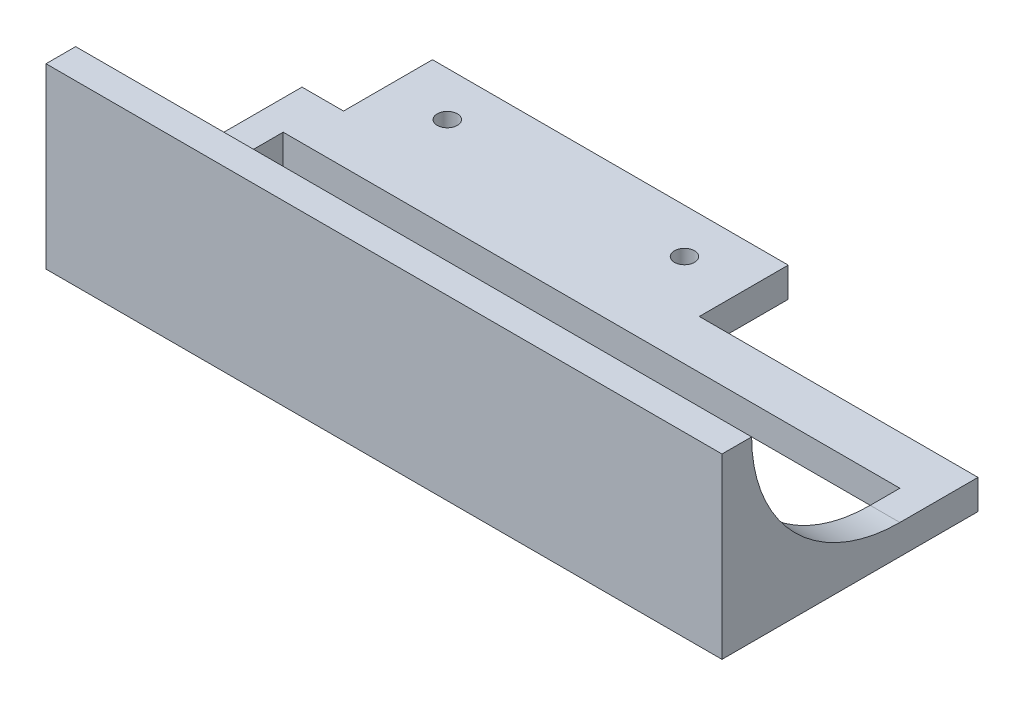
ISO-10303-21;
HEADER;
FILE_DESCRIPTION(('STEP AP214'),'2;1');
FILE_NAME('part.step','',(''),(''),'','','');
FILE_SCHEMA(('AUTOMOTIVE_DESIGN { 1 0 10303 214 1 1 1 1 }'));
ENDSEC;
DATA;
#1=APPLICATION_CONTEXT('core data for automotive mechanical design processes');
#2=APPLICATION_PROTOCOL_DEFINITION('international standard','automotive_design',2000,#1);
#3=PRODUCT_CONTEXT('',#1,'mechanical');
#4=PRODUCT('Part','Part','',(#3));
#5=PRODUCT_RELATED_PRODUCT_CATEGORY('part','',(#4));
#6=PRODUCT_DEFINITION_FORMATION('','',#4);
#7=PRODUCT_DEFINITION_CONTEXT('part definition',#1,'design');
#8=PRODUCT_DEFINITION('design','',#6,#7);
#9=PRODUCT_DEFINITION_SHAPE('','',#8);
#10=(LENGTH_UNIT() NAMED_UNIT(*) SI_UNIT(.MILLI.,.METRE.));
#11=(NAMED_UNIT(*) PLANE_ANGLE_UNIT() SI_UNIT($,.RADIAN.));
#12=(NAMED_UNIT(*) SI_UNIT($,.STERADIAN.) SOLID_ANGLE_UNIT());
#13=UNCERTAINTY_MEASURE_WITH_UNIT(LENGTH_MEASURE(1.E-05),#10,'distance_accuracy_value','');
#14=(GEOMETRIC_REPRESENTATION_CONTEXT(3) GLOBAL_UNCERTAINTY_ASSIGNED_CONTEXT((#13)) GLOBAL_UNIT_ASSIGNED_CONTEXT((#10,
#11,#12)) REPRESENTATION_CONTEXT('',''));
#15=CARTESIAN_POINT('',(0.,0.,0.));
#16=DIRECTION('',(0.,0.,1.));
#17=DIRECTION('',(1.,0.,0.));
#18=AXIS2_PLACEMENT_3D('',#15,#16,#17);
#19=CARTESIAN_POINT('',(7.,5.,0.));
#20=DIRECTION('',(1.,0.,0.));
#21=DIRECTION('',(0.,0.,-1.));
#22=AXIS2_PLACEMENT_3D('',#19,#20,#21);
#23=PLANE('',#22);
#24=DIRECTION('',(0.,0.,1.));
#25=VECTOR('',#24,1.);
#26=CARTESIAN_POINT('',(7.,0.,0.));
#27=LINE('',#26,#25);
#28=CARTESIAN_POINT('',(7.,0.,8.52801006597785));
#29=VERTEX_POINT('',#28);
#30=CARTESIAN_POINT('',(7.,0.,23.5280100659778));
#31=VERTEX_POINT('',#30);
#32=EDGE_CURVE('E225',#29,#31,#27,.T.);
#33=ORIENTED_EDGE('',*,*,#32,.T.);
#34=DIRECTION('',(0.,-1.,0.));
#35=VECTOR('',#34,1.);
#36=CARTESIAN_POINT('',(7.,5.,23.5280100659778));
#37=LINE('',#36,#35);
#38=CARTESIAN_POINT('',(7.,5.,23.5280100659778));
#39=VERTEX_POINT('',#38);
#40=EDGE_CURVE('E262',#39,#31,#37,.T.);
#41=ORIENTED_EDGE('',*,*,#40,.F.);
#42=DIRECTION('',(0.,0.,1.));
#43=VECTOR('',#42,1.);
#44=CARTESIAN_POINT('',(7.,5.,0.));
#45=LINE('',#44,#43);
#46=CARTESIAN_POINT('',(7.,5.,8.52801006597785));
#47=VERTEX_POINT('',#46);
#48=EDGE_CURVE('E187',#47,#39,#45,.T.);
#49=ORIENTED_EDGE('',*,*,#48,.F.);
#50=DIRECTION('',(0.,-1.,0.));
#51=VECTOR('',#50,1.);
#52=CARTESIAN_POINT('',(7.,5.,8.52801006597785));
#53=LINE('',#52,#51);
#54=EDGE_CURVE('E248',#47,#29,#53,.T.);
#55=ORIENTED_EDGE('',*,*,#54,.T.);
#56=EDGE_LOOP('',(#33,#41,#49,#55));
#57=FACE_BOUND('',#56,.T.);
#58=ADVANCED_FACE('F35',(#57),#23,.F.);
#59=CARTESIAN_POINT('',(0.,5.,23.5280100659778));
#60=DIRECTION('',(0.,0.,1.));
#61=DIRECTION('',(1.,0.,0.));
#62=AXIS2_PLACEMENT_3D('',#59,#60,#61);
#63=PLANE('',#62);
#64=DIRECTION('',(-1.,0.,0.));
#65=VECTOR('',#64,1.);
#66=CARTESIAN_POINT('',(0.,0.,23.5280100659778));
#67=LINE('',#66,#65);
#68=CARTESIAN_POINT('',(0.,0.,23.5280100659778));
#69=VERTEX_POINT('',#68);
#70=EDGE_CURVE('E228',#31,#69,#67,.T.);
#71=ORIENTED_EDGE('',*,*,#70,.T.);
#72=DIRECTION('',(0.,-1.,0.));
#73=VECTOR('',#72,1.);
#74=CARTESIAN_POINT('',(0.,5.,23.5280100659778));
#75=LINE('',#74,#73);
#76=CARTESIAN_POINT('',(0.,5.,23.5280100659778));
#77=VERTEX_POINT('',#76);
#78=EDGE_CURVE('E260',#77,#69,#75,.T.);
#79=ORIENTED_EDGE('',*,*,#78,.F.);
#80=DIRECTION('',(-1.,0.,0.));
#81=VECTOR('',#80,1.);
#82=CARTESIAN_POINT('',(0.,5.,23.5280100659778));
#83=LINE('',#82,#81);
#84=EDGE_CURVE('E190',#39,#77,#83,.T.);
#85=ORIENTED_EDGE('',*,*,#84,.F.);
#86=ORIENTED_EDGE('',*,*,#40,.T.);
#87=EDGE_LOOP('',(#71,#79,#85,#86));
#88=FACE_BOUND('',#87,.T.);
#89=ADVANCED_FACE('F319',(#88),#63,.F.);
#90=CARTESIAN_POINT('',(0.,5.,0.));
#91=DIRECTION('',(-1.,0.,0.));
#92=DIRECTION('',(0.,0.,1.));
#93=AXIS2_PLACEMENT_3D('',#90,#91,#92);
#94=PLANE('',#93);
#95=DIRECTION('',(0.,0.,-1.));
#96=VECTOR('',#95,1.);
#97=CARTESIAN_POINT('',(0.,0.,0.));
#98=LINE('',#97,#96);
#99=CARTESIAN_POINT('',(0.,0.,66.7030100659778));
#100=VERTEX_POINT('',#99);
#101=EDGE_CURVE('E231',#100,#69,#98,.T.);
#102=ORIENTED_EDGE('',*,*,#101,.F.);
#103=DIRECTION('',(0.,-1.,0.));
#104=VECTOR('',#103,1.);
#105=CARTESIAN_POINT('',(0.,5.,66.7030100659778));
#106=LINE('',#105,#104);
#107=CARTESIAN_POINT('',(0.,30.,66.7030100659778));
#108=VERTEX_POINT('',#107);
#109=EDGE_CURVE('E164',#108,#100,#106,.T.);
#110=ORIENTED_EDGE('',*,*,#109,.F.);
#111=DIRECTION('',(0.,0.,1.));
#112=VECTOR('',#111,1.);
#113=CARTESIAN_POINT('',(0.,30.,61.7030100659778));
#114=LINE('',#113,#112);
#115=CARTESIAN_POINT('',(0.,30.,61.7030100659778));
#116=VERTEX_POINT('',#115);
#117=EDGE_CURVE('E156',#116,#108,#114,.T.);
#118=ORIENTED_EDGE('',*,*,#117,.F.);
#119=CARTESIAN_POINT('',(0.,30.,36.7030100659778));
#120=DIRECTION('',(-1.,0.,0.));
#121=DIRECTION('',(0.,0.,1.));
#122=AXIS2_PLACEMENT_3D('',#119,#120,#121);
#123=CIRCLE('',#122,25.);
#124=CARTESIAN_POINT('',(0.,5.,36.7030100659778));
#125=VERTEX_POINT('',#124);
#126=EDGE_CURVE('E141',#116,#125,#123,.F.);
#127=ORIENTED_EDGE('',*,*,#126,.T.);
#128=DIRECTION('',(0.,0.,-1.));
#129=VECTOR('',#128,1.);
#130=CARTESIAN_POINT('',(0.,5.,0.));
#131=LINE('',#130,#129);
#132=EDGE_CURVE('E193',#125,#77,#131,.T.);
#133=ORIENTED_EDGE('',*,*,#132,.T.);
#134=ORIENTED_EDGE('',*,*,#78,.T.);
#135=EDGE_LOOP('',(#102,#110,#118,#127,#133,#134));
#136=FACE_BOUND('',#135,.T.);
#137=ADVANCED_FACE('F163',(#136),#94,.T.);
#138=CARTESIAN_POINT('',(0.,5.,66.7030100659778));
#139=DIRECTION('',(0.,0.,1.));
#140=DIRECTION('',(1.,0.,0.));
#141=AXIS2_PLACEMENT_3D('',#138,#139,#140);
#142=PLANE('',#141);
#143=DIRECTION('',(-1.,0.,0.));
#144=VECTOR('',#143,1.);
#145=CARTESIAN_POINT('',(0.,0.,66.7030100659778));
#146=LINE('',#145,#144);
#147=CARTESIAN_POINT('',(114.,0.,66.7030100659778));
#148=VERTEX_POINT('',#147);
#149=EDGE_CURVE('E234',#148,#100,#146,.T.);
#150=ORIENTED_EDGE('',*,*,#149,.F.);
#151=DIRECTION('',(0.,-1.,0.));
#152=VECTOR('',#151,1.);
#153=CARTESIAN_POINT('',(114.,5.,66.7030100659778));
#154=LINE('',#153,#152);
#155=CARTESIAN_POINT('',(114.,30.,66.7030100659778));
#156=VERTEX_POINT('',#155);
#157=EDGE_CURVE('E257',#156,#148,#154,.T.);
#158=ORIENTED_EDGE('',*,*,#157,.F.);
#159=DIRECTION('',(1.,0.,0.));
#160=VECTOR('',#159,1.);
#161=CARTESIAN_POINT('',(0.,30.,66.7030100659778));
#162=LINE('',#161,#160);
#163=EDGE_CURVE('E165',#108,#156,#162,.T.);
#164=ORIENTED_EDGE('',*,*,#163,.F.);
#165=ORIENTED_EDGE('',*,*,#109,.T.);
#166=EDGE_LOOP('',(#150,#158,#164,#165));
#167=FACE_BOUND('',#166,.T.);
#168=ADVANCED_FACE('F298',(#167),#142,.T.);
#169=CARTESIAN_POINT('',(114.,5.,0.));
#170=DIRECTION('',(1.,0.,0.));
#171=DIRECTION('',(0.,0.,-1.));
#172=AXIS2_PLACEMENT_3D('',#169,#170,#171);
#173=PLANE('',#172);
#174=DIRECTION('',(0.,0.,1.));
#175=VECTOR('',#174,1.);
#176=CARTESIAN_POINT('',(114.,0.,0.));
#177=LINE('',#176,#175);
#178=CARTESIAN_POINT('',(114.,0.,23.5280100659778));
#179=VERTEX_POINT('',#178);
#180=EDGE_CURVE('E237',#179,#148,#177,.T.);
#181=ORIENTED_EDGE('',*,*,#180,.F.);
#182=DIRECTION('',(0.,-1.,0.));
#183=VECTOR('',#182,1.);
#184=CARTESIAN_POINT('',(114.,5.,23.5280100659778));
#185=LINE('',#184,#183);
#186=CARTESIAN_POINT('',(114.,5.,23.5280100659778));
#187=VERTEX_POINT('',#186);
#188=EDGE_CURVE('E255',#187,#179,#185,.T.);
#189=ORIENTED_EDGE('',*,*,#188,.F.);
#190=DIRECTION('',(0.,0.,1.));
#191=VECTOR('',#190,1.);
#192=CARTESIAN_POINT('',(114.,5.,0.));
#193=LINE('',#192,#191);
#194=CARTESIAN_POINT('',(114.,5.,36.7030100659778));
#195=VERTEX_POINT('',#194);
#196=EDGE_CURVE('E195',#187,#195,#193,.T.);
#197=ORIENTED_EDGE('',*,*,#196,.T.);
#198=CARTESIAN_POINT('',(114.,30.,36.7030100659778));
#199=DIRECTION('',(1.,0.,0.));
#200=DIRECTION('',(0.,0.,-1.));
#201=AXIS2_PLACEMENT_3D('',#198,#199,#200);
#202=CIRCLE('',#201,25.);
#203=CARTESIAN_POINT('',(114.,30.,61.7030100659778));
#204=VERTEX_POINT('',#203);
#205=EDGE_CURVE('E11',#195,#204,#202,.F.);
#206=ORIENTED_EDGE('',*,*,#205,.T.);
#207=DIRECTION('',(0.,0.,-1.));
#208=VECTOR('',#207,1.);
#209=CARTESIAN_POINT('',(114.,30.,66.7030100659778));
#210=LINE('',#209,#208);
#211=EDGE_CURVE('E167',#156,#204,#210,.T.);
#212=ORIENTED_EDGE('',*,*,#211,.F.);
#213=ORIENTED_EDGE('',*,*,#157,.T.);
#214=EDGE_LOOP('',(#181,#189,#197,#206,#212,#213));
#215=FACE_BOUND('',#214,.T.);
#216=ADVANCED_FACE('F295',(#215),#173,.T.);
#217=CARTESIAN_POINT('',(0.,5.,23.5280100659778));
#218=DIRECTION('',(0.,0.,-1.));
#219=DIRECTION('',(-1.,0.,0.));
#220=AXIS2_PLACEMENT_3D('',#217,#218,#219);
#221=PLANE('',#220);
#222=DIRECTION('',(1.,0.,0.));
#223=VECTOR('',#222,1.);
#224=CARTESIAN_POINT('',(0.,0.,23.5280100659778));
#225=LINE('',#224,#223);
#226=CARTESIAN_POINT('',(67.,0.,23.5280100659778));
#227=VERTEX_POINT('',#226);
#228=EDGE_CURVE('E240',#227,#179,#225,.T.);
#229=ORIENTED_EDGE('',*,*,#228,.F.);
#230=DIRECTION('',(0.,-1.,0.));
#231=VECTOR('',#230,1.);
#232=CARTESIAN_POINT('',(67.,5.,23.5280100659778));
#233=LINE('',#232,#231);
#234=CARTESIAN_POINT('',(67.,5.,23.5280100659778));
#235=VERTEX_POINT('',#234);
#236=EDGE_CURVE('E253',#235,#227,#233,.T.);
#237=ORIENTED_EDGE('',*,*,#236,.F.);
#238=DIRECTION('',(1.,0.,0.));
#239=VECTOR('',#238,1.);
#240=CARTESIAN_POINT('',(0.,5.,23.5280100659778));
#241=LINE('',#240,#239);
#242=EDGE_CURVE('E198',#235,#187,#241,.T.);
#243=ORIENTED_EDGE('',*,*,#242,.T.);
#244=ORIENTED_EDGE('',*,*,#188,.T.);
#245=EDGE_LOOP('',(#229,#237,#243,#244));
#246=FACE_BOUND('',#245,.T.);
#247=ADVANCED_FACE('F305',(#246),#221,.T.);
#248=CARTESIAN_POINT('',(67.,5.,0.));
#249=DIRECTION('',(1.,0.,0.));
#250=DIRECTION('',(0.,0.,-1.));
#251=AXIS2_PLACEMENT_3D('',#248,#249,#250);
#252=PLANE('',#251);
#253=DIRECTION('',(0.,0.,1.));
#254=VECTOR('',#253,1.);
#255=CARTESIAN_POINT('',(67.,0.,0.));
#256=LINE('',#255,#254);
#257=CARTESIAN_POINT('',(67.,0.,8.52801006597785));
#258=VERTEX_POINT('',#257);
#259=EDGE_CURVE('E243',#258,#227,#256,.T.);
#260=ORIENTED_EDGE('',*,*,#259,.F.);
#261=DIRECTION('',(0.,-1.,0.));
#262=VECTOR('',#261,1.);
#263=CARTESIAN_POINT('',(67.,5.,8.52801006597785));
#264=LINE('',#263,#262);
#265=CARTESIAN_POINT('',(67.,5.,8.52801006597785));
#266=VERTEX_POINT('',#265);
#267=EDGE_CURVE('E250',#266,#258,#264,.T.);
#268=ORIENTED_EDGE('',*,*,#267,.F.);
#269=DIRECTION('',(0.,0.,1.));
#270=VECTOR('',#269,1.);
#271=CARTESIAN_POINT('',(67.,5.,0.));
#272=LINE('',#271,#270);
#273=EDGE_CURVE('E201',#266,#235,#272,.T.);
#274=ORIENTED_EDGE('',*,*,#273,.T.);
#275=ORIENTED_EDGE('',*,*,#236,.T.);
#276=EDGE_LOOP('',(#260,#268,#274,#275));
#277=FACE_BOUND('',#276,.T.);
#278=ADVANCED_FACE('F310',(#277),#252,.T.);
#279=CARTESIAN_POINT('',(5.,5.,0.));
#280=DIRECTION('',(1.,0.,0.));
#281=DIRECTION('',(0.,0.,-1.));
#282=AXIS2_PLACEMENT_3D('',#279,#280,#281);
#283=PLANE('',#282);
#284=DIRECTION('',(0.,0.,1.));
#285=VECTOR('',#284,1.);
#286=CARTESIAN_POINT('',(5.,0.,0.));
#287=LINE('',#286,#285);
#288=CARTESIAN_POINT('',(5.00000000000001,0.,31.7030100659779));
#289=VERTEX_POINT('',#288);
#290=CARTESIAN_POINT('',(5.00000000000001,0.,61.7030100659778));
#291=VERTEX_POINT('',#290);
#292=EDGE_CURVE('E213',#289,#291,#287,.T.);
#293=ORIENTED_EDGE('',*,*,#292,.F.);
#294=DIRECTION('',(0.,-1.,0.));
#295=VECTOR('',#294,1.);
#296=CARTESIAN_POINT('',(5.00000000000001,5.,31.7030100659779));
#297=LINE('',#296,#295);
#298=CARTESIAN_POINT('',(5.00000000000001,5.,31.7030100659779));
#299=VERTEX_POINT('',#298);
#300=EDGE_CURVE('E251',#299,#289,#297,.T.);
#301=ORIENTED_EDGE('',*,*,#300,.F.);
#302=DIRECTION('',(0.,0.,1.));
#303=VECTOR('',#302,1.);
#304=CARTESIAN_POINT('',(5.,5.,0.));
#305=LINE('',#304,#303);
#306=CARTESIAN_POINT('',(5.00000000000001,5.,36.7030100659778));
#307=VERTEX_POINT('',#306);
#308=EDGE_CURVE('E180',#299,#307,#305,.T.);
#309=ORIENTED_EDGE('',*,*,#308,.T.);
#310=CARTESIAN_POINT('',(5.00000000000001,30.,36.7030100659778));
#311=DIRECTION('',(1.,0.,0.));
#312=DIRECTION('',(0.,0.,-1.));
#313=AXIS2_PLACEMENT_3D('',#310,#311,#312);
#314=CIRCLE('',#313,25.);
#315=CARTESIAN_POINT('',(5.,30.,61.7030100659778));
#316=VERTEX_POINT('',#315);
#317=EDGE_CURVE('E148',#307,#316,#314,.F.);
#318=ORIENTED_EDGE('',*,*,#317,.T.);
#319=DIRECTION('',(0.,-1.,0.));
#320=VECTOR('',#319,1.);
#321=CARTESIAN_POINT('',(5.00000000000001,5.,61.7030100659778));
#322=LINE('',#321,#320);
#323=EDGE_CURVE('E207',#316,#291,#322,.T.);
#324=ORIENTED_EDGE('',*,*,#323,.T.);
#325=EDGE_LOOP('',(#293,#301,#309,#318,#324));
#326=FACE_BOUND('',#325,.T.);
#327=ADVANCED_FACE('F277',(#326),#283,.T.);
#328=CARTESIAN_POINT('',(0.,5.,31.7030100659779));
#329=DIRECTION('',(0.,0.,1.));
#330=DIRECTION('',(1.,0.,0.));
#331=AXIS2_PLACEMENT_3D('',#328,#329,#330);
#332=PLANE('',#331);
#333=DIRECTION('',(-1.,0.,0.));
#334=VECTOR('',#333,1.);
#335=CARTESIAN_POINT('',(0.,0.,31.7030100659779));
#336=LINE('',#335,#334);
#337=CARTESIAN_POINT('',(109.,0.,31.7030100659778));
#338=VERTEX_POINT('',#337);
#339=EDGE_CURVE('E216',#338,#289,#336,.T.);
#340=ORIENTED_EDGE('',*,*,#339,.F.);
#341=DIRECTION('',(0.,-1.,0.));
#342=VECTOR('',#341,1.);
#343=CARTESIAN_POINT('',(109.,5.,31.7030100659778));
#344=LINE('',#343,#342);
#345=CARTESIAN_POINT('',(109.,5.,31.7030100659778));
#346=VERTEX_POINT('',#345);
#347=EDGE_CURVE('E269',#346,#338,#344,.T.);
#348=ORIENTED_EDGE('',*,*,#347,.F.);
#349=DIRECTION('',(-1.,0.,0.));
#350=VECTOR('',#349,1.);
#351=CARTESIAN_POINT('',(0.,5.,31.7030100659779));
#352=LINE('',#351,#350);
#353=EDGE_CURVE('E182',#346,#299,#352,.T.);
#354=ORIENTED_EDGE('',*,*,#353,.T.);
#355=ORIENTED_EDGE('',*,*,#300,.T.);
#356=EDGE_LOOP('',(#340,#348,#354,#355));
#357=FACE_BOUND('',#356,.T.);
#358=ADVANCED_FACE('F284',(#357),#332,.T.);
#359=CARTESIAN_POINT('',(109.,5.,0.));
#360=DIRECTION('',(-1.,0.,0.));
#361=DIRECTION('',(0.,0.,1.));
#362=AXIS2_PLACEMENT_3D('',#359,#360,#361);
#363=PLANE('',#362);
#364=DIRECTION('',(0.,0.,-1.));
#365=VECTOR('',#364,1.);
#366=CARTESIAN_POINT('',(109.,0.,0.));
#367=LINE('',#366,#365);
#368=CARTESIAN_POINT('',(109.,0.,61.7030100659778));
#369=VERTEX_POINT('',#368);
#370=EDGE_CURVE('E219',#369,#338,#367,.T.);
#371=ORIENTED_EDGE('',*,*,#370,.F.);
#372=DIRECTION('',(0.,-1.,0.));
#373=VECTOR('',#372,1.);
#374=CARTESIAN_POINT('',(109.,5.,61.7030100659778));
#375=LINE('',#374,#373);
#376=CARTESIAN_POINT('',(109.,30.,61.7030100659778));
#377=VERTEX_POINT('',#376);
#378=EDGE_CURVE('E267',#377,#369,#375,.T.);
#379=ORIENTED_EDGE('',*,*,#378,.F.);
#380=CARTESIAN_POINT('',(109.,30.,36.7030100659778));
#381=DIRECTION('',(-1.,0.,0.));
#382=DIRECTION('',(0.,0.,1.));
#383=AXIS2_PLACEMENT_3D('',#380,#381,#382);
#384=CIRCLE('',#383,25.);
#385=CARTESIAN_POINT('',(109.,5.,36.7030100659778));
#386=VERTEX_POINT('',#385);
#387=EDGE_CURVE('E43',#377,#386,#384,.F.);
#388=ORIENTED_EDGE('',*,*,#387,.T.);
#389=DIRECTION('',(0.,0.,-1.));
#390=VECTOR('',#389,1.);
#391=CARTESIAN_POINT('',(109.,5.,0.));
#392=LINE('',#391,#390);
#393=EDGE_CURVE('E185',#386,#346,#392,.T.);
#394=ORIENTED_EDGE('',*,*,#393,.T.);
#395=ORIENTED_EDGE('',*,*,#347,.T.);
#396=EDGE_LOOP('',(#371,#379,#388,#394,#395));
#397=FACE_BOUND('',#396,.T.);
#398=ADVANCED_FACE('F286',(#397),#363,.T.);
#399=CARTESIAN_POINT('',(0.,5.,61.7030100659778));
#400=DIRECTION('',(0.,0.,-1.));
#401=DIRECTION('',(-1.,0.,0.));
#402=AXIS2_PLACEMENT_3D('',#399,#400,#401);
#403=PLANE('',#402);
#404=ORIENTED_EDGE('',*,*,#323,.F.);
#405=DIRECTION('',(-1.,0.,0.));
#406=VECTOR('',#405,1.);
#407=CARTESIAN_POINT('',(114.,30.,61.7030100659778));
#408=LINE('',#407,#406);
#409=EDGE_CURVE('E159',#377,#316,#408,.T.);
#410=ORIENTED_EDGE('',*,*,#409,.F.);
#411=ORIENTED_EDGE('',*,*,#378,.T.);
#412=DIRECTION('',(1.,0.,0.));
#413=VECTOR('',#412,1.);
#414=CARTESIAN_POINT('',(0.,0.,61.7030100659778));
#415=LINE('',#414,#413);
#416=EDGE_CURVE('E222',#291,#369,#415,.T.);
#417=ORIENTED_EDGE('',*,*,#416,.F.);
#418=EDGE_LOOP('',(#404,#410,#411,#417));
#419=FACE_BOUND('',#418,.T.);
#420=ADVANCED_FACE('F330',(#419),#403,.T.);
#421=CARTESIAN_POINT('',(17.,5.,16.0280100659779));
#422=DIRECTION('',(0.,-1.,0.));
#423=DIRECTION('',(0.,0.,-1.));
#424=AXIS2_PLACEMENT_3D('',#421,#422,#423);
#425=CYLINDRICAL_SURFACE('',#424,1.7);
#426=CARTESIAN_POINT('',(17.,5.,16.0280100659779));
#427=DIRECTION('',(0.,1.,0.));
#428=DIRECTION('',(0.,0.,1.));
#429=AXIS2_PLACEMENT_3D('',#426,#427,#428);
#430=CIRCLE('',#429,1.7);
#431=CARTESIAN_POINT('',(17.,5.,17.7280100659779));
#432=VERTEX_POINT('',#431);
#433=EDGE_CURVE('E176',#432,#432,#430,.T.);
#434=ORIENTED_EDGE('',*,*,#433,.T.);
#435=EDGE_LOOP('',(#434));
#436=FACE_BOUND('',#435,.T.);
#437=CARTESIAN_POINT('',(17.,0.,16.0280100659779));
#438=DIRECTION('',(0.,1.,0.));
#439=DIRECTION('',(0.,0.,1.));
#440=AXIS2_PLACEMENT_3D('',#437,#438,#439);
#441=CIRCLE('',#440,1.7);
#442=CARTESIAN_POINT('',(17.,0.,17.7280100659779));
#443=VERTEX_POINT('',#442);
#444=EDGE_CURVE('E210',#443,#443,#441,.T.);
#445=ORIENTED_EDGE('',*,*,#444,.F.);
#446=EDGE_LOOP('',(#445));
#447=FACE_BOUND('',#446,.T.);
#448=ADVANCED_FACE('F333',(#436,#447),#425,.F.);
#449=CARTESIAN_POINT('',(57.,5.,16.0280100659778));
#450=DIRECTION('',(0.,-1.,0.));
#451=DIRECTION('',(0.,0.,-1.));
#452=AXIS2_PLACEMENT_3D('',#449,#450,#451);
#453=CYLINDRICAL_SURFACE('',#452,1.7);
#454=CARTESIAN_POINT('',(57.,5.,16.0280100659778));
#455=DIRECTION('',(0.,1.,0.));
#456=DIRECTION('',(0.,0.,1.));
#457=AXIS2_PLACEMENT_3D('',#454,#455,#456);
#458=CIRCLE('',#457,1.7);
#459=CARTESIAN_POINT('',(57.,5.,17.7280100659778));
#460=VERTEX_POINT('',#459);
#461=EDGE_CURVE('E173',#460,#460,#458,.T.);
#462=ORIENTED_EDGE('',*,*,#461,.T.);
#463=EDGE_LOOP('',(#462));
#464=FACE_BOUND('',#463,.T.);
#465=CARTESIAN_POINT('',(57.,0.,16.0280100659778));
#466=DIRECTION('',(0.,1.,0.));
#467=DIRECTION('',(0.,0.,1.));
#468=AXIS2_PLACEMENT_3D('',#465,#466,#467);
#469=CIRCLE('',#468,1.7);
#470=CARTESIAN_POINT('',(57.,0.,17.7280100659778));
#471=VERTEX_POINT('',#470);
#472=EDGE_CURVE('E172',#471,#471,#469,.T.);
#473=ORIENTED_EDGE('',*,*,#472,.F.);
#474=EDGE_LOOP('',(#473));
#475=FACE_BOUND('',#474,.T.);
#476=ADVANCED_FACE('F343',(#464,#475),#453,.F.);
#477=CARTESIAN_POINT('',(0.,5.,8.52801006597785));
#478=DIRECTION('',(0.,0.,-1.));
#479=DIRECTION('',(-1.,0.,0.));
#480=AXIS2_PLACEMENT_3D('',#477,#478,#479);
#481=PLANE('',#480);
#482=DIRECTION('',(1.,0.,0.));
#483=VECTOR('',#482,1.);
#484=CARTESIAN_POINT('',(0.,0.,8.52801006597785));
#485=LINE('',#484,#483);
#486=EDGE_CURVE('E177',#29,#258,#485,.T.);
#487=ORIENTED_EDGE('',*,*,#486,.F.);
#488=ORIENTED_EDGE('',*,*,#54,.F.);
#489=DIRECTION('',(1.,0.,0.));
#490=VECTOR('',#489,1.);
#491=CARTESIAN_POINT('',(0.,5.,8.52801006597785));
#492=LINE('',#491,#490);
#493=EDGE_CURVE('E204',#47,#266,#492,.T.);
#494=ORIENTED_EDGE('',*,*,#493,.T.);
#495=ORIENTED_EDGE('',*,*,#267,.T.);
#496=EDGE_LOOP('',(#487,#488,#494,#495));
#497=FACE_BOUND('',#496,.T.);
#498=ADVANCED_FACE('F313',(#497),#481,.T.);
#499=CARTESIAN_POINT('',(0.,5.,0.));
#500=DIRECTION('',(0.,1.,0.));
#501=DIRECTION('',(0.,0.,1.));
#502=AXIS2_PLACEMENT_3D('',#499,#500,#501);
#503=PLANE('',#502);
#504=ORIENTED_EDGE('',*,*,#132,.F.);
#505=DIRECTION('',(-1.,0.,0.));
#506=VECTOR('',#505,1.);
#507=CARTESIAN_POINT('',(5.00000000000001,5.,36.7030100659778));
#508=LINE('',#507,#506);
#509=EDGE_CURVE('E57',#125,#307,#508,.F.);
#510=ORIENTED_EDGE('',*,*,#509,.T.);
#511=ORIENTED_EDGE('',*,*,#308,.F.);
#512=ORIENTED_EDGE('',*,*,#353,.F.);
#513=ORIENTED_EDGE('',*,*,#393,.F.);
#514=DIRECTION('',(-1.,0.,0.));
#515=VECTOR('',#514,1.);
#516=CARTESIAN_POINT('',(114.,5.,36.7030100659778));
#517=LINE('',#516,#515);
#518=EDGE_CURVE('E265',#386,#195,#517,.F.);
#519=ORIENTED_EDGE('',*,*,#518,.T.);
#520=ORIENTED_EDGE('',*,*,#196,.F.);
#521=ORIENTED_EDGE('',*,*,#242,.F.);
#522=ORIENTED_EDGE('',*,*,#273,.F.);
#523=ORIENTED_EDGE('',*,*,#493,.F.);
#524=ORIENTED_EDGE('',*,*,#48,.T.);
#525=ORIENTED_EDGE('',*,*,#84,.T.);
#526=EDGE_LOOP('',(#504,#510,#511,#512,#513,#519,#520,#521,#522,#523,#524,#525));
#527=FACE_BOUND('',#526,.T.);
#528=ORIENTED_EDGE('',*,*,#461,.F.);
#529=EDGE_LOOP('',(#528));
#530=FACE_BOUND('',#529,.T.);
#531=ORIENTED_EDGE('',*,*,#433,.F.);
#532=EDGE_LOOP('',(#531));
#533=FACE_BOUND('',#532,.T.);
#534=ADVANCED_FACE('F279',(#527,#530,#533),#503,.T.);
#535=CARTESIAN_POINT('',(0.,0.,0.));
#536=DIRECTION('',(0.,1.,0.));
#537=DIRECTION('',(0.,0.,1.));
#538=AXIS2_PLACEMENT_3D('',#535,#536,#537);
#539=PLANE('',#538);
#540=ORIENTED_EDGE('',*,*,#472,.T.);
#541=EDGE_LOOP('',(#540));
#542=FACE_BOUND('',#541,.T.);
#543=ORIENTED_EDGE('',*,*,#444,.T.);
#544=EDGE_LOOP('',(#543));
#545=FACE_BOUND('',#544,.T.);
#546=ORIENTED_EDGE('',*,*,#292,.T.);
#547=ORIENTED_EDGE('',*,*,#416,.T.);
#548=ORIENTED_EDGE('',*,*,#370,.T.);
#549=ORIENTED_EDGE('',*,*,#339,.T.);
#550=EDGE_LOOP('',(#546,#547,#548,#549));
#551=FACE_BOUND('',#550,.T.);
#552=ORIENTED_EDGE('',*,*,#32,.F.);
#553=ORIENTED_EDGE('',*,*,#486,.T.);
#554=ORIENTED_EDGE('',*,*,#259,.T.);
#555=ORIENTED_EDGE('',*,*,#228,.T.);
#556=ORIENTED_EDGE('',*,*,#180,.T.);
#557=ORIENTED_EDGE('',*,*,#149,.T.);
#558=ORIENTED_EDGE('',*,*,#101,.T.);
#559=ORIENTED_EDGE('',*,*,#70,.F.);
#560=EDGE_LOOP('',(#552,#553,#554,#555,#556,#557,#558,#559));
#561=FACE_BOUND('',#560,.T.);
#562=ADVANCED_FACE('F302',(#542,#545,#551,#561),#539,.F.);
#563=CARTESIAN_POINT('',(0.,30.,0.));
#564=DIRECTION('',(0.,1.,0.));
#565=DIRECTION('',(0.,0.,1.));
#566=AXIS2_PLACEMENT_3D('',#563,#564,#565);
#567=PLANE('',#566);
#568=EDGE_CURVE('E161',#204,#377,#408,.T.);
#569=ORIENTED_EDGE('',*,*,#568,.T.);
#570=ORIENTED_EDGE('',*,*,#409,.T.);
#571=EDGE_CURVE('E145',#316,#116,#408,.T.);
#572=ORIENTED_EDGE('',*,*,#571,.T.);
#573=ORIENTED_EDGE('',*,*,#117,.T.);
#574=ORIENTED_EDGE('',*,*,#163,.T.);
#575=ORIENTED_EDGE('',*,*,#211,.T.);
#576=EDGE_LOOP('',(#569,#570,#572,#573,#574,#575));
#577=FACE_BOUND('',#576,.T.);
#578=ADVANCED_FACE('F154',(#577),#567,.T.);
#579=CARTESIAN_POINT('',(0.,30.,36.7030100659778));
#580=DIRECTION('',(1.,0.,0.));
#581=DIRECTION('',(0.,0.,-1.));
#582=AXIS2_PLACEMENT_3D('',#579,#580,#581);
#583=CYLINDRICAL_SURFACE('',#582,25.);
#584=ORIENTED_EDGE('',*,*,#317,.F.);
#585=ORIENTED_EDGE('',*,*,#509,.F.);
#586=ORIENTED_EDGE('',*,*,#126,.F.);
#587=ORIENTED_EDGE('',*,*,#571,.F.);
#588=EDGE_LOOP('',(#584,#585,#586,#587));
#589=FACE_BOUND('',#588,.T.);
#590=ADVANCED_FACE('F144',(#589),#583,.F.);
#591=CARTESIAN_POINT('',(0.,30.,36.7030100659778));
#592=DIRECTION('',(1.,0.,0.));
#593=DIRECTION('',(0.,0.,-1.));
#594=AXIS2_PLACEMENT_3D('',#591,#592,#593);
#595=CYLINDRICAL_SURFACE('',#594,25.);
#596=ORIENTED_EDGE('',*,*,#205,.F.);
#597=ORIENTED_EDGE('',*,*,#518,.F.);
#598=ORIENTED_EDGE('',*,*,#387,.F.);
#599=ORIENTED_EDGE('',*,*,#568,.F.);
#600=EDGE_LOOP('',(#596,#597,#598,#599));
#601=FACE_BOUND('',#600,.T.);
#602=ADVANCED_FACE('F37',(#601),#595,.F.);
#603=CLOSED_SHELL('',(#58,#89,#137,#168,#216,#247,#278,#327,#358,#398,#420,#448,#476,#498,#534,
#562,#578,#590,#602));
#604=MANIFOLD_SOLID_BREP('B2',#603);
#605=ADVANCED_BREP_SHAPE_REPRESENTATION('',(#18,#604),#14);
#606=SHAPE_DEFINITION_REPRESENTATION(#9,#605);
ENDSEC;
END-ISO-10303-21;
